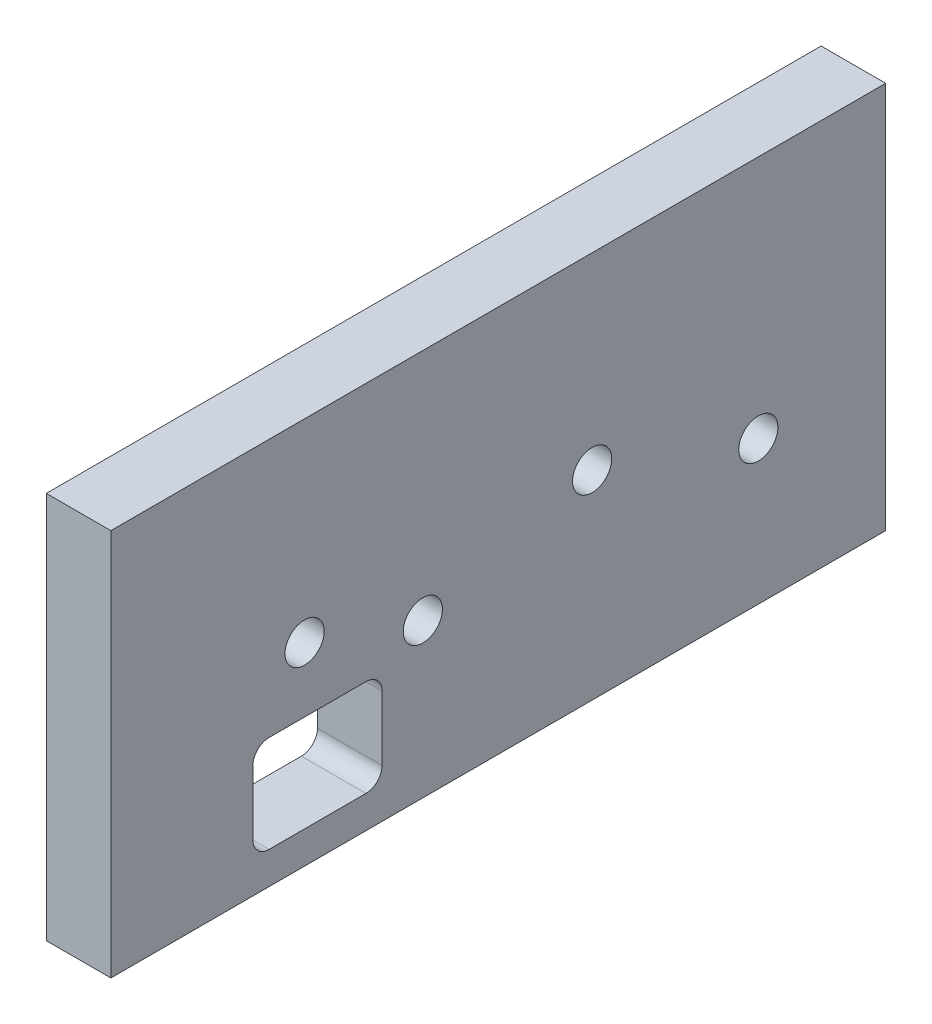
ISO-10303-21;
HEADER;
FILE_DESCRIPTION(('STEP AP214'),'2;1');
FILE_NAME('part.step','',(''),(''),'','','');
FILE_SCHEMA(('AUTOMOTIVE_DESIGN { 1 0 10303 214 1 1 1 1 }'));
ENDSEC;
DATA;
#1=APPLICATION_CONTEXT('core data for automotive mechanical design processes');
#2=APPLICATION_PROTOCOL_DEFINITION('international standard','automotive_design',2000,#1);
#3=PRODUCT_CONTEXT('',#1,'mechanical');
#4=PRODUCT('Part','Part','',(#3));
#5=PRODUCT_RELATED_PRODUCT_CATEGORY('part','',(#4));
#6=PRODUCT_DEFINITION_FORMATION('','',#4);
#7=PRODUCT_DEFINITION_CONTEXT('part definition',#1,'design');
#8=PRODUCT_DEFINITION('design','',#6,#7);
#9=PRODUCT_DEFINITION_SHAPE('','',#8);
#10=(LENGTH_UNIT() NAMED_UNIT(*) SI_UNIT(.MILLI.,.METRE.));
#11=(NAMED_UNIT(*) PLANE_ANGLE_UNIT() SI_UNIT($,.RADIAN.));
#12=(NAMED_UNIT(*) SI_UNIT($,.STERADIAN.) SOLID_ANGLE_UNIT());
#13=UNCERTAINTY_MEASURE_WITH_UNIT(LENGTH_MEASURE(1.E-05),#10,'distance_accuracy_value','');
#14=(GEOMETRIC_REPRESENTATION_CONTEXT(3) GLOBAL_UNCERTAINTY_ASSIGNED_CONTEXT((#13)) GLOBAL_UNIT_ASSIGNED_CONTEXT((#10,
#11,#12)) REPRESENTATION_CONTEXT('',''));
#15=CARTESIAN_POINT('',(0.,0.,0.));
#16=DIRECTION('',(0.,0.,1.));
#17=DIRECTION('',(1.,0.,0.));
#18=AXIS2_PLACEMENT_3D('',#15,#16,#17);
#19=CARTESIAN_POINT('',(12.7,-9.873506971,-51.1434579937716));
#20=DIRECTION('',(-1.,0.,0.));
#21=DIRECTION('',(0.,0.,1.));
#22=AXIS2_PLACEMENT_3D('',#19,#20,#21);
#23=CYLINDRICAL_SURFACE('',#22,3.85455777521835);
#24=CARTESIAN_POINT('',(12.7,-9.873506971,-51.1434579937716));
#25=DIRECTION('',(1.,0.,0.));
#26=DIRECTION('',(0.,0.,-1.));
#27=AXIS2_PLACEMENT_3D('',#24,#25,#26);
#28=CIRCLE('',#27,3.85455777521835);
#29=CARTESIAN_POINT('',(12.7,-9.873506971,-54.99801576899));
#30=VERTEX_POINT('',#29);
#31=EDGE_CURVE('E334',#30,#30,#28,.T.);
#32=ORIENTED_EDGE('',*,*,#31,.T.);
#33=EDGE_LOOP('',(#32));
#34=FACE_BOUND('',#33,.T.);
#35=CARTESIAN_POINT('',(5.08,-9.873506971,-51.1434579937716));
#36=DIRECTION('',(-1.,0.,0.));
#37=DIRECTION('',(0.,0.,1.));
#38=AXIS2_PLACEMENT_3D('',#35,#36,#37);
#39=CIRCLE('',#38,3.85455777521835);
#40=CARTESIAN_POINT('',(5.08,-9.873506971,-47.2889002185533));
#41=VERTEX_POINT('',#40);
#42=EDGE_CURVE('E54',#41,#41,#39,.T.);
#43=ORIENTED_EDGE('',*,*,#42,.T.);
#44=EDGE_LOOP('',(#43));
#45=FACE_BOUND('',#44,.T.);
#46=ADVANCED_FACE('F50',(#34,#45),#23,.F.);
#47=CARTESIAN_POINT('',(12.7,1.096077429,-18.4577335821185));
#48=DIRECTION('',(-1.,0.,0.));
#49=DIRECTION('',(0.,0.,1.));
#50=AXIS2_PLACEMENT_3D('',#47,#48,#49);
#51=CYLINDRICAL_SURFACE('',#50,3.85455777521835);
#52=CARTESIAN_POINT('',(12.7,1.096077429,-18.4577335821185));
#53=DIRECTION('',(1.,0.,0.));
#54=DIRECTION('',(0.,0.,-1.));
#55=AXIS2_PLACEMENT_3D('',#52,#53,#54);
#56=CIRCLE('',#55,3.85455777521835);
#57=CARTESIAN_POINT('',(12.7,1.096077429,-22.3122913573368));
#58=VERTEX_POINT('',#57);
#59=EDGE_CURVE('E330',#58,#58,#56,.T.);
#60=ORIENTED_EDGE('',*,*,#59,.T.);
#61=EDGE_LOOP('',(#60));
#62=FACE_BOUND('',#61,.T.);
#63=CARTESIAN_POINT('',(5.08,1.096077429,-18.4577335821185));
#64=DIRECTION('',(-1.,0.,0.));
#65=DIRECTION('',(0.,0.,1.));
#66=AXIS2_PLACEMENT_3D('',#63,#64,#65);
#67=CIRCLE('',#66,3.85455777521835);
#68=CARTESIAN_POINT('',(5.08,1.096077429,-14.6031758069001));
#69=VERTEX_POINT('',#68);
#70=EDGE_CURVE('E370',#69,#69,#67,.T.);
#71=ORIENTED_EDGE('',*,*,#70,.T.);
#72=EDGE_LOOP('',(#71));
#73=FACE_BOUND('',#72,.T.);
#74=ADVANCED_FACE('F460',(#62,#73),#51,.F.);
#75=CARTESIAN_POINT('',(12.7,0.,38.1));
#76=DIRECTION('',(-1.,0.,0.));
#77=DIRECTION('',(0.,0.,1.));
#78=AXIS2_PLACEMENT_3D('',#75,#76,#77);
#79=CYLINDRICAL_SURFACE('',#78,3.85455777521835);
#80=CARTESIAN_POINT('',(12.7,0.,38.1));
#81=DIRECTION('',(1.,0.,0.));
#82=DIRECTION('',(0.,0.,-1.));
#83=AXIS2_PLACEMENT_3D('',#80,#81,#82);
#84=CIRCLE('',#83,3.85455777521835);
#85=CARTESIAN_POINT('',(12.7,0.,34.2454422247817));
#86=VERTEX_POINT('',#85);
#87=EDGE_CURVE('E326',#86,#86,#84,.T.);
#88=ORIENTED_EDGE('',*,*,#87,.T.);
#89=EDGE_LOOP('',(#88));
#90=FACE_BOUND('',#89,.T.);
#91=CARTESIAN_POINT('',(5.08,0.,38.1));
#92=DIRECTION('',(-1.,0.,0.));
#93=DIRECTION('',(0.,0.,1.));
#94=AXIS2_PLACEMENT_3D('',#91,#92,#93);
#95=CIRCLE('',#94,3.85455777521835);
#96=CARTESIAN_POINT('',(5.08,0.,41.9545577752184));
#97=VERTEX_POINT('',#96);
#98=EDGE_CURVE('E367',#97,#97,#95,.T.);
#99=ORIENTED_EDGE('',*,*,#98,.T.);
#100=EDGE_LOOP('',(#99));
#101=FACE_BOUND('',#100,.T.);
#102=ADVANCED_FACE('F429',(#90,#101),#79,.F.);
#103=CARTESIAN_POINT('',(12.7,-7.860160654,14.8360220129459));
#104=DIRECTION('',(-1.,0.,0.));
#105=DIRECTION('',(0.,0.,1.));
#106=AXIS2_PLACEMENT_3D('',#103,#104,#105);
#107=CYLINDRICAL_SURFACE('',#106,3.85455777521835);
#108=CARTESIAN_POINT('',(12.7,-7.860160654,14.8360220129459));
#109=DIRECTION('',(1.,0.,0.));
#110=DIRECTION('',(0.,0.,-1.));
#111=AXIS2_PLACEMENT_3D('',#108,#109,#110);
#112=CIRCLE('',#111,3.85455777521835);
#113=CARTESIAN_POINT('',(12.7,-7.860160654,10.9814642377276));
#114=VERTEX_POINT('',#113);
#115=EDGE_CURVE('E338',#114,#114,#112,.T.);
#116=ORIENTED_EDGE('',*,*,#115,.T.);
#117=EDGE_LOOP('',(#116));
#118=FACE_BOUND('',#117,.T.);
#119=CARTESIAN_POINT('',(5.08,-7.860160654,14.8360220129459));
#120=DIRECTION('',(-1.,0.,0.));
#121=DIRECTION('',(0.,0.,1.));
#122=AXIS2_PLACEMENT_3D('',#119,#120,#121);
#123=CIRCLE('',#122,3.85455777521835);
#124=CARTESIAN_POINT('',(5.08,-7.860160654,18.6905797881643));
#125=VERTEX_POINT('',#124);
#126=EDGE_CURVE('E257',#125,#125,#123,.T.);
#127=ORIENTED_EDGE('',*,*,#126,.T.);
#128=EDGE_LOOP('',(#127));
#129=FACE_BOUND('',#128,.T.);
#130=ADVANCED_FACE('F426',(#118,#129),#107,.F.);
#131=CARTESIAN_POINT('',(12.7,-38.1,0.));
#132=DIRECTION('',(0.,1.,0.));
#133=DIRECTION('',(0.,0.,1.));
#134=AXIS2_PLACEMENT_3D('',#131,#132,#133);
#135=PLANE('',#134);
#136=CARTESIAN_POINT('',(6.35000000000002,-38.1,-63.5));
#137=DIRECTION('',(0.,-1.,0.));
#138=DIRECTION('',(0.,0.,-1.));
#139=AXIS2_PLACEMENT_3D('',#136,#137,#138);
#140=CIRCLE('',#139,3.17499999999999);
#141=CARTESIAN_POINT('',(6.35000000000002,-38.1,-66.675));
#142=VERTEX_POINT('',#141);
#143=EDGE_CURVE('E285',#142,#142,#140,.T.);
#144=ORIENTED_EDGE('',*,*,#143,.F.);
#145=EDGE_LOOP('',(#144));
#146=FACE_BOUND('',#145,.T.);
#147=CARTESIAN_POINT('',(6.35000000000001,-38.1,0.));
#148=DIRECTION('',(0.,-1.,0.));
#149=DIRECTION('',(0.,0.,-1.));
#150=AXIS2_PLACEMENT_3D('',#147,#148,#149);
#151=CIRCLE('',#150,3.17499999999999);
#152=CARTESIAN_POINT('',(6.35000000000001,-38.1,-3.17499999999997));
#153=VERTEX_POINT('',#152);
#154=EDGE_CURVE('E293',#153,#153,#151,.T.);
#155=ORIENTED_EDGE('',*,*,#154,.F.);
#156=EDGE_LOOP('',(#155));
#157=FACE_BOUND('',#156,.T.);
#158=CARTESIAN_POINT('',(6.35,-38.1,57.15));
#159=DIRECTION('',(0.,-1.,0.));
#160=DIRECTION('',(0.,0.,-1.));
#161=AXIS2_PLACEMENT_3D('',#158,#159,#160);
#162=CIRCLE('',#161,3.17499999999999);
#163=CARTESIAN_POINT('',(6.35,-38.1,53.975));
#164=VERTEX_POINT('',#163);
#165=EDGE_CURVE('E301',#164,#164,#162,.T.);
#166=ORIENTED_EDGE('',*,*,#165,.F.);
#167=EDGE_LOOP('',(#166));
#168=FACE_BOUND('',#167,.T.);
#169=DIRECTION('',(0.,0.,-1.));
#170=VECTOR('',#169,1.);
#171=CARTESIAN_POINT('',(0.,-38.1,0.));
#172=LINE('',#171,#170);
#173=CARTESIAN_POINT('',(0.,-38.1,76.2));
#174=VERTEX_POINT('',#173);
#175=CARTESIAN_POINT('',(0.,-38.1,-76.2));
#176=VERTEX_POINT('',#175);
#177=EDGE_CURVE('E309',#174,#176,#172,.T.);
#178=ORIENTED_EDGE('',*,*,#177,.T.);
#179=DIRECTION('',(-1.,0.,0.));
#180=VECTOR('',#179,1.);
#181=CARTESIAN_POINT('',(12.7,-38.1,-76.2));
#182=LINE('',#181,#180);
#183=CARTESIAN_POINT('',(12.7,-38.1,-76.2));
#184=VERTEX_POINT('',#183);
#185=EDGE_CURVE('E11',#184,#176,#182,.T.);
#186=ORIENTED_EDGE('',*,*,#185,.F.);
#187=DIRECTION('',(0.,0.,-1.));
#188=VECTOR('',#187,1.);
#189=CARTESIAN_POINT('',(12.7,-38.1,0.));
#190=LINE('',#189,#188);
#191=CARTESIAN_POINT('',(12.7,-38.1,76.2));
#192=VERTEX_POINT('',#191);
#193=EDGE_CURVE('E310',#192,#184,#190,.T.);
#194=ORIENTED_EDGE('',*,*,#193,.F.);
#195=DIRECTION('',(-1.,0.,0.));
#196=VECTOR('',#195,1.);
#197=CARTESIAN_POINT('',(12.7,-38.1,76.2));
#198=LINE('',#197,#196);
#199=EDGE_CURVE('E342',#192,#174,#198,.T.);
#200=ORIENTED_EDGE('',*,*,#199,.T.);
#201=EDGE_LOOP('',(#178,#186,#194,#200));
#202=FACE_BOUND('',#201,.T.);
#203=ADVANCED_FACE('F52',(#146,#157,#168,#202),#135,.F.);
#204=CARTESIAN_POINT('',(12.7,0.,-76.2));
#205=DIRECTION('',(0.,0.,1.));
#206=DIRECTION('',(1.,0.,0.));
#207=AXIS2_PLACEMENT_3D('',#204,#205,#206);
#208=PLANE('',#207);
#209=DIRECTION('',(0.,1.,0.));
#210=VECTOR('',#209,1.);
#211=CARTESIAN_POINT('',(0.,0.,-76.2));
#212=LINE('',#211,#210);
#213=CARTESIAN_POINT('',(0.,38.1,-76.2));
#214=VERTEX_POINT('',#213);
#215=EDGE_CURVE('E346',#176,#214,#212,.T.);
#216=ORIENTED_EDGE('',*,*,#215,.T.);
#217=DIRECTION('',(-1.,0.,0.));
#218=VECTOR('',#217,1.);
#219=CARTESIAN_POINT('',(12.7,38.1,-76.2));
#220=LINE('',#219,#218);
#221=CARTESIAN_POINT('',(12.7,38.1,-76.2));
#222=VERTEX_POINT('',#221);
#223=EDGE_CURVE('E60',#222,#214,#220,.T.);
#224=ORIENTED_EDGE('',*,*,#223,.F.);
#225=DIRECTION('',(0.,1.,0.));
#226=VECTOR('',#225,1.);
#227=CARTESIAN_POINT('',(12.7,0.,-76.2));
#228=LINE('',#227,#226);
#229=EDGE_CURVE('E314',#184,#222,#228,.T.);
#230=ORIENTED_EDGE('',*,*,#229,.F.);
#231=ORIENTED_EDGE('',*,*,#185,.T.);
#232=EDGE_LOOP('',(#216,#224,#230,#231));
#233=FACE_BOUND('',#232,.T.);
#234=ADVANCED_FACE('F414',(#233),#208,.F.);
#235=CARTESIAN_POINT('',(12.7,38.1,0.));
#236=DIRECTION('',(0.,1.,0.));
#237=DIRECTION('',(0.,0.,1.));
#238=AXIS2_PLACEMENT_3D('',#235,#236,#237);
#239=PLANE('',#238);
#240=DIRECTION('',(0.,0.,-1.));
#241=VECTOR('',#240,1.);
#242=CARTESIAN_POINT('',(0.,38.1,0.));
#243=LINE('',#242,#241);
#244=CARTESIAN_POINT('',(0.,38.1,76.2));
#245=VERTEX_POINT('',#244);
#246=EDGE_CURVE('E350',#245,#214,#243,.T.);
#247=ORIENTED_EDGE('',*,*,#246,.F.);
#248=DIRECTION('',(-1.,0.,0.));
#249=VECTOR('',#248,1.);
#250=CARTESIAN_POINT('',(12.7,38.1,76.2));
#251=LINE('',#250,#249);
#252=CARTESIAN_POINT('',(12.7,38.1,76.2));
#253=VERTEX_POINT('',#252);
#254=EDGE_CURVE('E359',#253,#245,#251,.T.);
#255=ORIENTED_EDGE('',*,*,#254,.F.);
#256=DIRECTION('',(0.,0.,-1.));
#257=VECTOR('',#256,1.);
#258=CARTESIAN_POINT('',(12.7,38.1,0.));
#259=LINE('',#258,#257);
#260=EDGE_CURVE('E318',#253,#222,#259,.T.);
#261=ORIENTED_EDGE('',*,*,#260,.T.);
#262=ORIENTED_EDGE('',*,*,#223,.T.);
#263=EDGE_LOOP('',(#247,#255,#261,#262));
#264=FACE_BOUND('',#263,.T.);
#265=ADVANCED_FACE('F411',(#264),#239,.T.);
#266=CARTESIAN_POINT('',(12.7,0.,76.2));
#267=DIRECTION('',(0.,0.,1.));
#268=DIRECTION('',(1.,0.,0.));
#269=AXIS2_PLACEMENT_3D('',#266,#267,#268);
#270=PLANE('',#269);
#271=DIRECTION('',(0.,1.,0.));
#272=VECTOR('',#271,1.);
#273=CARTESIAN_POINT('',(0.,0.,76.2));
#274=LINE('',#273,#272);
#275=EDGE_CURVE('E315',#174,#245,#274,.T.);
#276=ORIENTED_EDGE('',*,*,#275,.F.);
#277=ORIENTED_EDGE('',*,*,#199,.F.);
#278=DIRECTION('',(0.,1.,0.));
#279=VECTOR('',#278,1.);
#280=CARTESIAN_POINT('',(12.7,0.,76.2));
#281=LINE('',#280,#279);
#282=EDGE_CURVE('E322',#192,#253,#281,.T.);
#283=ORIENTED_EDGE('',*,*,#282,.T.);
#284=ORIENTED_EDGE('',*,*,#254,.T.);
#285=EDGE_LOOP('',(#276,#277,#283,#284));
#286=FACE_BOUND('',#285,.T.);
#287=ADVANCED_FACE('F405',(#286),#270,.T.);
#288=CARTESIAN_POINT('',(12.7,0.,0.));
#289=DIRECTION('',(1.,0.,0.));
#290=DIRECTION('',(0.,0.,-1.));
#291=AXIS2_PLACEMENT_3D('',#288,#289,#290);
#292=PLANE('',#291);
#293=CARTESIAN_POINT('',(12.7,-15.875,45.085));
#294=DIRECTION('',(-1.,0.,0.));
#295=DIRECTION('',(0.,0.,-1.));
#296=AXIS2_PLACEMENT_3D('',#293,#294,#295);
#297=CIRCLE('',#296,3.175);
#298=CARTESIAN_POINT('',(12.7,-15.875,48.26));
#299=VERTEX_POINT('',#298);
#300=CARTESIAN_POINT('',(12.7,-12.7,45.085));
#301=VERTEX_POINT('',#300);
#302=EDGE_CURVE('E162',#299,#301,#297,.T.);
#303=ORIENTED_EDGE('',*,*,#302,.T.);
#304=DIRECTION('',(0.,0.,-1.));
#305=VECTOR('',#304,1.);
#306=CARTESIAN_POINT('',(12.7,-12.7,26.035));
#307=LINE('',#306,#305);
#308=CARTESIAN_POINT('',(12.7,-12.7,26.035));
#309=VERTEX_POINT('',#308);
#310=EDGE_CURVE('E172',#301,#309,#307,.T.);
#311=ORIENTED_EDGE('',*,*,#310,.T.);
#312=CARTESIAN_POINT('',(12.7,-15.875,26.035));
#313=DIRECTION('',(-1.,0.,0.));
#314=DIRECTION('',(0.,0.,1.));
#315=AXIS2_PLACEMENT_3D('',#312,#313,#314);
#316=CIRCLE('',#315,3.175);
#317=CARTESIAN_POINT('',(12.7,-15.875,22.86));
#318=VERTEX_POINT('',#317);
#319=EDGE_CURVE('E71',#309,#318,#316,.T.);
#320=ORIENTED_EDGE('',*,*,#319,.T.);
#321=DIRECTION('',(0.,-1.,0.));
#322=VECTOR('',#321,1.);
#323=CARTESIAN_POINT('',(12.7,-15.875,22.86));
#324=LINE('',#323,#322);
#325=CARTESIAN_POINT('',(12.7,-28.575,22.86));
#326=VERTEX_POINT('',#325);
#327=EDGE_CURVE('E191',#318,#326,#324,.T.);
#328=ORIENTED_EDGE('',*,*,#327,.T.);
#329=CARTESIAN_POINT('',(12.7,-28.575,26.035));
#330=DIRECTION('',(-1.,0.,0.));
#331=DIRECTION('',(0.,0.,1.));
#332=AXIS2_PLACEMENT_3D('',#329,#330,#331);
#333=CIRCLE('',#332,3.175);
#334=CARTESIAN_POINT('',(12.7,-31.75,26.035));
#335=VERTEX_POINT('',#334);
#336=EDGE_CURVE('E195',#326,#335,#333,.T.);
#337=ORIENTED_EDGE('',*,*,#336,.T.);
#338=DIRECTION('',(0.,0.,1.));
#339=VECTOR('',#338,1.);
#340=CARTESIAN_POINT('',(12.7,-31.75,26.035));
#341=LINE('',#340,#339);
#342=CARTESIAN_POINT('',(12.7,-31.75,45.085));
#343=VERTEX_POINT('',#342);
#344=EDGE_CURVE('E199',#335,#343,#341,.T.);
#345=ORIENTED_EDGE('',*,*,#344,.T.);
#346=CARTESIAN_POINT('',(12.7,-28.575,45.085));
#347=DIRECTION('',(-1.,0.,0.));
#348=DIRECTION('',(0.,0.,1.));
#349=AXIS2_PLACEMENT_3D('',#346,#347,#348);
#350=CIRCLE('',#349,3.175);
#351=CARTESIAN_POINT('',(12.7,-28.575,48.26));
#352=VERTEX_POINT('',#351);
#353=EDGE_CURVE('E203',#343,#352,#350,.T.);
#354=ORIENTED_EDGE('',*,*,#353,.T.);
#355=DIRECTION('',(0.,1.,0.));
#356=VECTOR('',#355,1.);
#357=CARTESIAN_POINT('',(12.7,-15.875,48.26));
#358=LINE('',#357,#356);
#359=EDGE_CURVE('E169',#352,#299,#358,.T.);
#360=ORIENTED_EDGE('',*,*,#359,.T.);
#361=EDGE_LOOP('',(#303,#311,#320,#328,#337,#345,#354,#360));
#362=FACE_BOUND('',#361,.T.);
#363=ORIENTED_EDGE('',*,*,#193,.T.);
#364=ORIENTED_EDGE('',*,*,#229,.T.);
#365=ORIENTED_EDGE('',*,*,#260,.F.);
#366=ORIENTED_EDGE('',*,*,#282,.F.);
#367=EDGE_LOOP('',(#363,#364,#365,#366));
#368=FACE_BOUND('',#367,.T.);
#369=ORIENTED_EDGE('',*,*,#87,.F.);
#370=EDGE_LOOP('',(#369));
#371=FACE_BOUND('',#370,.T.);
#372=ORIENTED_EDGE('',*,*,#59,.F.);
#373=EDGE_LOOP('',(#372));
#374=FACE_BOUND('',#373,.T.);
#375=ORIENTED_EDGE('',*,*,#31,.F.);
#376=EDGE_LOOP('',(#375));
#377=FACE_BOUND('',#376,.T.);
#378=ORIENTED_EDGE('',*,*,#115,.F.);
#379=EDGE_LOOP('',(#378));
#380=FACE_BOUND('',#379,.T.);
#381=ADVANCED_FACE('F177',(#362,#368,#371,#374,#377,#380),#292,.T.);
#382=CARTESIAN_POINT('',(0.,0.,0.));
#383=DIRECTION('',(1.,0.,0.));
#384=DIRECTION('',(0.,0.,-1.));
#385=AXIS2_PLACEMENT_3D('',#382,#383,#384);
#386=PLANE('',#385);
#387=DIRECTION('',(0.,0.,-1.));
#388=VECTOR('',#387,1.);
#389=CARTESIAN_POINT('',(0.,-12.7,26.035));
#390=LINE('',#389,#388);
#391=CARTESIAN_POINT('',(0.,-12.7,45.085));
#392=VERTEX_POINT('',#391);
#393=CARTESIAN_POINT('',(0.,-12.7,26.035));
#394=VERTEX_POINT('',#393);
#395=EDGE_CURVE('E210',#392,#394,#390,.T.);
#396=ORIENTED_EDGE('',*,*,#395,.F.);
#397=CARTESIAN_POINT('',(0.,-15.875,45.085));
#398=DIRECTION('',(-1.,0.,0.));
#399=DIRECTION('',(0.,0.,-1.));
#400=AXIS2_PLACEMENT_3D('',#397,#398,#399);
#401=CIRCLE('',#400,3.175);
#402=CARTESIAN_POINT('',(0.,-15.875,48.26));
#403=VERTEX_POINT('',#402);
#404=EDGE_CURVE('E82',#403,#392,#401,.T.);
#405=ORIENTED_EDGE('',*,*,#404,.F.);
#406=DIRECTION('',(0.,1.,0.));
#407=VECTOR('',#406,1.);
#408=CARTESIAN_POINT('',(0.,-15.875,48.26));
#409=LINE('',#408,#407);
#410=CARTESIAN_POINT('',(0.,-28.575,48.26));
#411=VERTEX_POINT('',#410);
#412=EDGE_CURVE('E182',#411,#403,#409,.T.);
#413=ORIENTED_EDGE('',*,*,#412,.F.);
#414=CARTESIAN_POINT('',(0.,-28.575,45.085));
#415=DIRECTION('',(-1.,0.,0.));
#416=DIRECTION('',(0.,0.,1.));
#417=AXIS2_PLACEMENT_3D('',#414,#415,#416);
#418=CIRCLE('',#417,3.175);
#419=CARTESIAN_POINT('',(0.,-31.75,45.085));
#420=VERTEX_POINT('',#419);
#421=EDGE_CURVE('E186',#420,#411,#418,.T.);
#422=ORIENTED_EDGE('',*,*,#421,.F.);
#423=DIRECTION('',(0.,0.,1.));
#424=VECTOR('',#423,1.);
#425=CARTESIAN_POINT('',(0.,-31.75,26.035));
#426=LINE('',#425,#424);
#427=CARTESIAN_POINT('',(0.,-31.75,26.035));
#428=VERTEX_POINT('',#427);
#429=EDGE_CURVE('E225',#428,#420,#426,.T.);
#430=ORIENTED_EDGE('',*,*,#429,.F.);
#431=CARTESIAN_POINT('',(0.,-28.575,26.035));
#432=DIRECTION('',(-1.,0.,0.));
#433=DIRECTION('',(0.,0.,1.));
#434=AXIS2_PLACEMENT_3D('',#431,#432,#433);
#435=CIRCLE('',#434,3.175);
#436=CARTESIAN_POINT('',(0.,-28.575,22.86));
#437=VERTEX_POINT('',#436);
#438=EDGE_CURVE('E221',#437,#428,#435,.T.);
#439=ORIENTED_EDGE('',*,*,#438,.F.);
#440=DIRECTION('',(0.,-1.,0.));
#441=VECTOR('',#440,1.);
#442=CARTESIAN_POINT('',(0.,-15.875,22.86));
#443=LINE('',#442,#441);
#444=CARTESIAN_POINT('',(0.,-15.875,22.86));
#445=VERTEX_POINT('',#444);
#446=EDGE_CURVE('E217',#445,#437,#443,.T.);
#447=ORIENTED_EDGE('',*,*,#446,.F.);
#448=CARTESIAN_POINT('',(0.,-15.875,26.035));
#449=DIRECTION('',(-1.,0.,0.));
#450=DIRECTION('',(0.,0.,1.));
#451=AXIS2_PLACEMENT_3D('',#448,#449,#450);
#452=CIRCLE('',#451,3.175);
#453=EDGE_CURVE('E213',#394,#445,#452,.T.);
#454=ORIENTED_EDGE('',*,*,#453,.F.);
#455=EDGE_LOOP('',(#396,#405,#413,#422,#430,#439,#447,#454));
#456=FACE_BOUND('',#455,.T.);
#457=CARTESIAN_POINT('',(0.,0.,38.1));
#458=DIRECTION('',(-1.,0.,0.));
#459=DIRECTION('',(0.,0.,1.));
#460=AXIS2_PLACEMENT_3D('',#457,#458,#459);
#461=CIRCLE('',#460,7.9375);
#462=CARTESIAN_POINT('',(0.,0.,46.0375));
#463=VERTEX_POINT('',#462);
#464=EDGE_CURVE('E258',#463,#463,#461,.T.);
#465=ORIENTED_EDGE('',*,*,#464,.F.);
#466=EDGE_LOOP('',(#465));
#467=FACE_BOUND('',#466,.T.);
#468=CARTESIAN_POINT('',(0.,-7.860160654,14.8360220129459));
#469=DIRECTION('',(-1.,0.,0.));
#470=DIRECTION('',(0.,0.,1.));
#471=AXIS2_PLACEMENT_3D('',#468,#469,#470);
#472=CIRCLE('',#471,7.9375);
#473=CARTESIAN_POINT('',(0.,-7.860160654,22.7735220129459));
#474=VERTEX_POINT('',#473);
#475=EDGE_CURVE('E262',#474,#474,#472,.T.);
#476=ORIENTED_EDGE('',*,*,#475,.F.);
#477=EDGE_LOOP('',(#476));
#478=FACE_BOUND('',#477,.T.);
#479=CARTESIAN_POINT('',(0.,1.096077429,-18.4577335821185));
#480=DIRECTION('',(-1.,0.,0.));
#481=DIRECTION('',(0.,0.,1.));
#482=AXIS2_PLACEMENT_3D('',#479,#480,#481);
#483=CIRCLE('',#482,7.9375);
#484=CARTESIAN_POINT('',(0.,1.096077429,-10.5202335821185));
#485=VERTEX_POINT('',#484);
#486=EDGE_CURVE('E270',#485,#485,#483,.T.);
#487=ORIENTED_EDGE('',*,*,#486,.F.);
#488=EDGE_LOOP('',(#487));
#489=FACE_BOUND('',#488,.T.);
#490=CARTESIAN_POINT('',(0.,-9.873506971,-51.1434579937716));
#491=DIRECTION('',(-1.,0.,0.));
#492=DIRECTION('',(0.,0.,1.));
#493=AXIS2_PLACEMENT_3D('',#490,#491,#492);
#494=CIRCLE('',#493,7.9375);
#495=CARTESIAN_POINT('',(0.,-9.873506971,-43.2059579937716));
#496=VERTEX_POINT('',#495);
#497=EDGE_CURVE('E278',#496,#496,#494,.T.);
#498=ORIENTED_EDGE('',*,*,#497,.F.);
#499=EDGE_LOOP('',(#498));
#500=FACE_BOUND('',#499,.T.);
#501=ORIENTED_EDGE('',*,*,#177,.F.);
#502=ORIENTED_EDGE('',*,*,#275,.T.);
#503=ORIENTED_EDGE('',*,*,#246,.T.);
#504=ORIENTED_EDGE('',*,*,#215,.F.);
#505=EDGE_LOOP('',(#501,#502,#503,#504));
#506=FACE_BOUND('',#505,.T.);
#507=ADVANCED_FACE('F394',(#456,#467,#478,#489,#500,#506),#386,.F.);
#508=CARTESIAN_POINT('',(6.35,0.,57.15));
#509=DIRECTION('',(0.,-1.,0.));
#510=DIRECTION('',(0.,0.,-1.));
#511=AXIS2_PLACEMENT_3D('',#508,#509,#510);
#512=CONICAL_SURFACE('',#511,3.17499999999999,1.02974425867665);
#513=CARTESIAN_POINT('',(6.34999999999999,1.9077324654125,57.15));
#514=VERTEX_POINT('',#513);
#515=VERTEX_LOOP('',#514);
#516=FACE_BOUND('',#515,.T.);
#517=CARTESIAN_POINT('',(6.35,0.,57.15));
#518=DIRECTION('',(0.,-1.,0.));
#519=DIRECTION('',(0.,0.,-1.));
#520=AXIS2_PLACEMENT_3D('',#517,#518,#519);
#521=CIRCLE('',#520,3.17499999999999);
#522=CARTESIAN_POINT('',(6.35,0.,53.975));
#523=VERTEX_POINT('',#522);
#524=EDGE_CURVE('E305',#523,#523,#521,.T.);
#525=ORIENTED_EDGE('',*,*,#524,.T.);
#526=EDGE_LOOP('',(#525));
#527=FACE_BOUND('',#526,.T.);
#528=ADVANCED_FACE('F397',(#516,#527),#512,.F.);
#529=CARTESIAN_POINT('',(6.35,-38.1,57.15));
#530=DIRECTION('',(0.,-1.,0.));
#531=DIRECTION('',(0.,0.,-1.));
#532=AXIS2_PLACEMENT_3D('',#529,#530,#531);
#533=CYLINDRICAL_SURFACE('',#532,3.17499999999999);
#534=ORIENTED_EDGE('',*,*,#524,.F.);
#535=EDGE_LOOP('',(#534));
#536=FACE_BOUND('',#535,.T.);
#537=ORIENTED_EDGE('',*,*,#165,.T.);
#538=EDGE_LOOP('',(#537));
#539=FACE_BOUND('',#538,.T.);
#540=ADVANCED_FACE('F489',(#536,#539),#533,.F.);
#541=CARTESIAN_POINT('',(6.35000000000001,0.,0.));
#542=DIRECTION('',(0.,-1.,0.));
#543=DIRECTION('',(0.,0.,-1.));
#544=AXIS2_PLACEMENT_3D('',#541,#542,#543);
#545=CONICAL_SURFACE('',#544,3.17499999999999,1.02974425867665);
#546=CARTESIAN_POINT('',(6.35,1.9077324654125,0.));
#547=VERTEX_POINT('',#546);
#548=VERTEX_LOOP('',#547);
#549=FACE_BOUND('',#548,.T.);
#550=CARTESIAN_POINT('',(6.35000000000001,0.,0.));
#551=DIRECTION('',(0.,-1.,0.));
#552=DIRECTION('',(0.,0.,-1.));
#553=AXIS2_PLACEMENT_3D('',#550,#551,#552);
#554=CIRCLE('',#553,3.17499999999999);
#555=CARTESIAN_POINT('',(6.35000000000001,0.,-3.17499999999998));
#556=VERTEX_POINT('',#555);
#557=EDGE_CURVE('E297',#556,#556,#554,.T.);
#558=ORIENTED_EDGE('',*,*,#557,.T.);
#559=EDGE_LOOP('',(#558));
#560=FACE_BOUND('',#559,.T.);
#561=ADVANCED_FACE('F491',(#549,#560),#545,.F.);
#562=CARTESIAN_POINT('',(6.35000000000001,-38.1,0.));
#563=DIRECTION('',(0.,-1.,0.));
#564=DIRECTION('',(0.,0.,-1.));
#565=AXIS2_PLACEMENT_3D('',#562,#563,#564);
#566=CYLINDRICAL_SURFACE('',#565,3.17499999999999);
#567=ORIENTED_EDGE('',*,*,#557,.F.);
#568=EDGE_LOOP('',(#567));
#569=FACE_BOUND('',#568,.T.);
#570=ORIENTED_EDGE('',*,*,#154,.T.);
#571=EDGE_LOOP('',(#570));
#572=FACE_BOUND('',#571,.T.);
#573=ADVANCED_FACE('F496',(#569,#572),#566,.F.);
#574=CARTESIAN_POINT('',(6.35000000000002,0.,-63.5));
#575=DIRECTION('',(0.,-1.,0.));
#576=DIRECTION('',(0.,0.,-1.));
#577=AXIS2_PLACEMENT_3D('',#574,#575,#576);
#578=CONICAL_SURFACE('',#577,3.17499999999999,1.02974425867665);
#579=CARTESIAN_POINT('',(6.35000000000001,1.9077324654125,-63.5));
#580=VERTEX_POINT('',#579);
#581=VERTEX_LOOP('',#580);
#582=FACE_BOUND('',#581,.T.);
#583=CARTESIAN_POINT('',(6.35000000000002,0.,-63.5));
#584=DIRECTION('',(0.,-1.,0.));
#585=DIRECTION('',(0.,0.,-1.));
#586=AXIS2_PLACEMENT_3D('',#583,#584,#585);
#587=CIRCLE('',#586,3.17499999999999);
#588=CARTESIAN_POINT('',(6.35000000000002,0.,-66.675));
#589=VERTEX_POINT('',#588);
#590=EDGE_CURVE('E289',#589,#589,#587,.T.);
#591=ORIENTED_EDGE('',*,*,#590,.T.);
#592=EDGE_LOOP('',(#591));
#593=FACE_BOUND('',#592,.T.);
#594=ADVANCED_FACE('F506',(#582,#593),#578,.F.);
#595=CARTESIAN_POINT('',(6.35000000000002,-38.1,-63.5));
#596=DIRECTION('',(0.,-1.,0.));
#597=DIRECTION('',(0.,0.,-1.));
#598=AXIS2_PLACEMENT_3D('',#595,#596,#597);
#599=CYLINDRICAL_SURFACE('',#598,3.17499999999999);
#600=ORIENTED_EDGE('',*,*,#590,.F.);
#601=EDGE_LOOP('',(#600));
#602=FACE_BOUND('',#601,.T.);
#603=ORIENTED_EDGE('',*,*,#143,.T.);
#604=EDGE_LOOP('',(#603));
#605=FACE_BOUND('',#604,.T.);
#606=ADVANCED_FACE('F390',(#602,#605),#599,.F.);
#607=CARTESIAN_POINT('',(5.08,-9.873506971,-51.1434579937716));
#608=DIRECTION('',(-1.,0.,0.));
#609=DIRECTION('',(0.,0.,1.));
#610=AXIS2_PLACEMENT_3D('',#607,#608,#609);
#611=CYLINDRICAL_SURFACE('',#610,7.9375);
#612=CARTESIAN_POINT('',(5.08,-9.873506971,-51.1434579937716));
#613=DIRECTION('',(-1.,0.,0.));
#614=DIRECTION('',(0.,0.,1.));
#615=AXIS2_PLACEMENT_3D('',#612,#613,#614);
#616=CIRCLE('',#615,7.9375);
#617=CARTESIAN_POINT('',(5.08,-9.873506971,-43.2059579937716));
#618=VERTEX_POINT('',#617);
#619=EDGE_CURVE('E235',#618,#618,#616,.T.);
#620=ORIENTED_EDGE('',*,*,#619,.F.);
#621=EDGE_LOOP('',(#620));
#622=FACE_BOUND('',#621,.T.);
#623=ORIENTED_EDGE('',*,*,#497,.T.);
#624=EDGE_LOOP('',(#623));
#625=FACE_BOUND('',#624,.T.);
#626=ADVANCED_FACE('F384',(#622,#625),#611,.F.);
#627=CARTESIAN_POINT('',(5.08,-9.873506971,-51.1434579937716));
#628=DIRECTION('',(-1.,0.,0.));
#629=DIRECTION('',(0.,0.,1.));
#630=AXIS2_PLACEMENT_3D('',#627,#628,#629);
#631=PLANE('',#630);
#632=ORIENTED_EDGE('',*,*,#42,.F.);
#633=EDGE_LOOP('',(#632));
#634=FACE_BOUND('',#633,.T.);
#635=ORIENTED_EDGE('',*,*,#619,.T.);
#636=EDGE_LOOP('',(#635));
#637=FACE_BOUND('',#636,.T.);
#638=ADVANCED_FACE('F380',(#634,#637),#631,.T.);
#639=CARTESIAN_POINT('',(5.08,1.096077429,-18.4577335821185));
#640=DIRECTION('',(-1.,0.,0.));
#641=DIRECTION('',(0.,0.,1.));
#642=AXIS2_PLACEMENT_3D('',#639,#640,#641);
#643=CYLINDRICAL_SURFACE('',#642,7.9375);
#644=CARTESIAN_POINT('',(5.08,1.096077429,-18.4577335821185));
#645=DIRECTION('',(-1.,0.,0.));
#646=DIRECTION('',(0.,0.,1.));
#647=AXIS2_PLACEMENT_3D('',#644,#645,#646);
#648=CIRCLE('',#647,7.9375);
#649=CARTESIAN_POINT('',(5.08,1.096077429,-10.5202335821185));
#650=VERTEX_POINT('',#649);
#651=EDGE_CURVE('E274',#650,#650,#648,.T.);
#652=ORIENTED_EDGE('',*,*,#651,.F.);
#653=EDGE_LOOP('',(#652));
#654=FACE_BOUND('',#653,.T.);
#655=ORIENTED_EDGE('',*,*,#486,.T.);
#656=EDGE_LOOP('',(#655));
#657=FACE_BOUND('',#656,.T.);
#658=ADVANCED_FACE('F383',(#654,#657),#643,.F.);
#659=CARTESIAN_POINT('',(5.08,1.096077429,-18.4577335821185));
#660=DIRECTION('',(-1.,0.,0.));
#661=DIRECTION('',(0.,0.,1.));
#662=AXIS2_PLACEMENT_3D('',#659,#660,#661);
#663=PLANE('',#662);
#664=ORIENTED_EDGE('',*,*,#70,.F.);
#665=EDGE_LOOP('',(#664));
#666=FACE_BOUND('',#665,.T.);
#667=ORIENTED_EDGE('',*,*,#651,.T.);
#668=EDGE_LOOP('',(#667));
#669=FACE_BOUND('',#668,.T.);
#670=ADVANCED_FACE('F443',(#666,#669),#663,.T.);
#671=CARTESIAN_POINT('',(5.08,-7.860160654,14.8360220129459));
#672=DIRECTION('',(-1.,0.,0.));
#673=DIRECTION('',(0.,0.,1.));
#674=AXIS2_PLACEMENT_3D('',#671,#672,#673);
#675=CYLINDRICAL_SURFACE('',#674,7.9375);
#676=CARTESIAN_POINT('',(5.08,-7.860160654,14.8360220129459));
#677=DIRECTION('',(-1.,0.,0.));
#678=DIRECTION('',(0.,0.,1.));
#679=AXIS2_PLACEMENT_3D('',#676,#677,#678);
#680=CIRCLE('',#679,7.9375);
#681=CARTESIAN_POINT('',(5.08,-7.860160654,22.7735220129459));
#682=VERTEX_POINT('',#681);
#683=EDGE_CURVE('E266',#682,#682,#680,.T.);
#684=ORIENTED_EDGE('',*,*,#683,.F.);
#685=EDGE_LOOP('',(#684));
#686=FACE_BOUND('',#685,.T.);
#687=ORIENTED_EDGE('',*,*,#475,.T.);
#688=EDGE_LOOP('',(#687));
#689=FACE_BOUND('',#688,.T.);
#690=ADVANCED_FACE('F437',(#686,#689),#675,.F.);
#691=CARTESIAN_POINT('',(5.08,-7.860160654,14.8360220129459));
#692=DIRECTION('',(-1.,0.,0.));
#693=DIRECTION('',(0.,0.,1.));
#694=AXIS2_PLACEMENT_3D('',#691,#692,#693);
#695=PLANE('',#694);
#696=ORIENTED_EDGE('',*,*,#126,.F.);
#697=EDGE_LOOP('',(#696));
#698=FACE_BOUND('',#697,.T.);
#699=ORIENTED_EDGE('',*,*,#683,.T.);
#700=EDGE_LOOP('',(#699));
#701=FACE_BOUND('',#700,.T.);
#702=ADVANCED_FACE('F433',(#698,#701),#695,.T.);
#703=CARTESIAN_POINT('',(5.08,0.,38.1));
#704=DIRECTION('',(-1.,0.,0.));
#705=DIRECTION('',(0.,0.,1.));
#706=AXIS2_PLACEMENT_3D('',#703,#704,#705);
#707=CYLINDRICAL_SURFACE('',#706,7.9375);
#708=CARTESIAN_POINT('',(5.08,0.,38.1));
#709=DIRECTION('',(-1.,0.,0.));
#710=DIRECTION('',(0.,0.,1.));
#711=AXIS2_PLACEMENT_3D('',#708,#709,#710);
#712=CIRCLE('',#711,7.9375);
#713=CARTESIAN_POINT('',(5.08,0.,46.0375));
#714=VERTEX_POINT('',#713);
#715=EDGE_CURVE('E253',#714,#714,#712,.T.);
#716=ORIENTED_EDGE('',*,*,#715,.F.);
#717=EDGE_LOOP('',(#716));
#718=FACE_BOUND('',#717,.T.);
#719=ORIENTED_EDGE('',*,*,#464,.T.);
#720=EDGE_LOOP('',(#719));
#721=FACE_BOUND('',#720,.T.);
#722=ADVANCED_FACE('F436',(#718,#721),#707,.F.);
#723=CARTESIAN_POINT('',(5.08,0.,38.1));
#724=DIRECTION('',(-1.,0.,0.));
#725=DIRECTION('',(0.,0.,1.));
#726=AXIS2_PLACEMENT_3D('',#723,#724,#725);
#727=PLANE('',#726);
#728=ORIENTED_EDGE('',*,*,#98,.F.);
#729=EDGE_LOOP('',(#728));
#730=FACE_BOUND('',#729,.T.);
#731=ORIENTED_EDGE('',*,*,#715,.T.);
#732=EDGE_LOOP('',(#731));
#733=FACE_BOUND('',#732,.T.);
#734=ADVANCED_FACE('F574',(#730,#733),#727,.T.);
#735=CARTESIAN_POINT('',(12.7,-15.875,45.085));
#736=DIRECTION('',(-1.,0.,0.));
#737=DIRECTION('',(0.,0.,1.));
#738=AXIS2_PLACEMENT_3D('',#735,#736,#737);
#739=CYLINDRICAL_SURFACE('',#738,3.175);
#740=ORIENTED_EDGE('',*,*,#404,.T.);
#741=DIRECTION('',(-1.,0.,0.));
#742=VECTOR('',#741,1.);
#743=CARTESIAN_POINT('',(12.7,-12.7,45.085));
#744=LINE('',#743,#742);
#745=EDGE_CURVE('E158',#301,#392,#744,.T.);
#746=ORIENTED_EDGE('',*,*,#745,.F.);
#747=ORIENTED_EDGE('',*,*,#302,.F.);
#748=DIRECTION('',(-1.,0.,0.));
#749=VECTOR('',#748,1.);
#750=CARTESIAN_POINT('',(12.7,-15.875,48.26));
#751=LINE('',#750,#749);
#752=EDGE_CURVE('E232',#299,#403,#751,.T.);
#753=ORIENTED_EDGE('',*,*,#752,.T.);
#754=EDGE_LOOP('',(#740,#746,#747,#753));
#755=FACE_BOUND('',#754,.T.);
#756=ADVANCED_FACE('F160',(#755),#739,.F.);
#757=CARTESIAN_POINT('',(12.7,-15.875,48.26));
#758=DIRECTION('',(0.,0.,1.));
#759=DIRECTION('',(1.,0.,0.));
#760=AXIS2_PLACEMENT_3D('',#757,#758,#759);
#761=PLANE('',#760);
#762=ORIENTED_EDGE('',*,*,#412,.T.);
#763=ORIENTED_EDGE('',*,*,#752,.F.);
#764=ORIENTED_EDGE('',*,*,#359,.F.);
#765=DIRECTION('',(-1.,0.,0.));
#766=VECTOR('',#765,1.);
#767=CARTESIAN_POINT('',(12.7,-28.575,48.26));
#768=LINE('',#767,#766);
#769=EDGE_CURVE('E236',#352,#411,#768,.T.);
#770=ORIENTED_EDGE('',*,*,#769,.T.);
#771=EDGE_LOOP('',(#762,#763,#764,#770));
#772=FACE_BOUND('',#771,.T.);
#773=ADVANCED_FACE('F586',(#772),#761,.F.);
#774=CARTESIAN_POINT('',(12.7,-28.575,45.085));
#775=DIRECTION('',(-1.,0.,0.));
#776=DIRECTION('',(0.,0.,1.));
#777=AXIS2_PLACEMENT_3D('',#774,#775,#776);
#778=CYLINDRICAL_SURFACE('',#777,3.175);
#779=ORIENTED_EDGE('',*,*,#421,.T.);
#780=ORIENTED_EDGE('',*,*,#769,.F.);
#781=ORIENTED_EDGE('',*,*,#353,.F.);
#782=DIRECTION('',(-1.,0.,0.));
#783=VECTOR('',#782,1.);
#784=CARTESIAN_POINT('',(12.7,-31.75,45.085));
#785=LINE('',#784,#783);
#786=EDGE_CURVE('E239',#343,#420,#785,.T.);
#787=ORIENTED_EDGE('',*,*,#786,.T.);
#788=EDGE_LOOP('',(#779,#780,#781,#787));
#789=FACE_BOUND('',#788,.T.);
#790=ADVANCED_FACE('F594',(#789),#778,.F.);
#791=CARTESIAN_POINT('',(12.7,-31.75,26.035));
#792=DIRECTION('',(0.,-1.,0.));
#793=DIRECTION('',(0.,0.,-1.));
#794=AXIS2_PLACEMENT_3D('',#791,#792,#793);
#795=PLANE('',#794);
#796=ORIENTED_EDGE('',*,*,#429,.T.);
#797=ORIENTED_EDGE('',*,*,#786,.F.);
#798=ORIENTED_EDGE('',*,*,#344,.F.);
#799=DIRECTION('',(-1.,0.,0.));
#800=VECTOR('',#799,1.);
#801=CARTESIAN_POINT('',(12.7,-31.75,26.035));
#802=LINE('',#801,#800);
#803=EDGE_CURVE('E242',#335,#428,#802,.T.);
#804=ORIENTED_EDGE('',*,*,#803,.T.);
#805=EDGE_LOOP('',(#796,#797,#798,#804));
#806=FACE_BOUND('',#805,.T.);
#807=ADVANCED_FACE('F603',(#806),#795,.F.);
#808=CARTESIAN_POINT('',(12.7,-28.575,26.035));
#809=DIRECTION('',(-1.,0.,0.));
#810=DIRECTION('',(0.,0.,1.));
#811=AXIS2_PLACEMENT_3D('',#808,#809,#810);
#812=CYLINDRICAL_SURFACE('',#811,3.175);
#813=ORIENTED_EDGE('',*,*,#438,.T.);
#814=ORIENTED_EDGE('',*,*,#803,.F.);
#815=ORIENTED_EDGE('',*,*,#336,.F.);
#816=DIRECTION('',(-1.,0.,0.));
#817=VECTOR('',#816,1.);
#818=CARTESIAN_POINT('',(12.7,-28.575,22.86));
#819=LINE('',#818,#817);
#820=EDGE_CURVE('E245',#326,#437,#819,.T.);
#821=ORIENTED_EDGE('',*,*,#820,.T.);
#822=EDGE_LOOP('',(#813,#814,#815,#821));
#823=FACE_BOUND('',#822,.T.);
#824=ADVANCED_FACE('F612',(#823),#812,.F.);
#825=CARTESIAN_POINT('',(12.7,-15.875,22.86));
#826=DIRECTION('',(0.,0.,-1.));
#827=DIRECTION('',(-1.,0.,0.));
#828=AXIS2_PLACEMENT_3D('',#825,#826,#827);
#829=PLANE('',#828);
#830=ORIENTED_EDGE('',*,*,#446,.T.);
#831=ORIENTED_EDGE('',*,*,#820,.F.);
#832=ORIENTED_EDGE('',*,*,#327,.F.);
#833=DIRECTION('',(-1.,0.,0.));
#834=VECTOR('',#833,1.);
#835=CARTESIAN_POINT('',(12.7,-15.875,22.86));
#836=LINE('',#835,#834);
#837=EDGE_CURVE('E248',#318,#445,#836,.T.);
#838=ORIENTED_EDGE('',*,*,#837,.T.);
#839=EDGE_LOOP('',(#830,#831,#832,#838));
#840=FACE_BOUND('',#839,.T.);
#841=ADVANCED_FACE('F621',(#840),#829,.F.);
#842=CARTESIAN_POINT('',(12.7,-15.875,26.035));
#843=DIRECTION('',(-1.,0.,0.));
#844=DIRECTION('',(0.,0.,1.));
#845=AXIS2_PLACEMENT_3D('',#842,#843,#844);
#846=CYLINDRICAL_SURFACE('',#845,3.175);
#847=ORIENTED_EDGE('',*,*,#453,.T.);
#848=ORIENTED_EDGE('',*,*,#837,.F.);
#849=ORIENTED_EDGE('',*,*,#319,.F.);
#850=DIRECTION('',(-1.,0.,0.));
#851=VECTOR('',#850,1.);
#852=CARTESIAN_POINT('',(12.7,-12.7,26.035));
#853=LINE('',#852,#851);
#854=EDGE_CURVE('E168',#309,#394,#853,.T.);
#855=ORIENTED_EDGE('',*,*,#854,.T.);
#856=EDGE_LOOP('',(#847,#848,#849,#855));
#857=FACE_BOUND('',#856,.T.);
#858=ADVANCED_FACE('F630',(#857),#846,.F.);
#859=CARTESIAN_POINT('',(12.7,-12.7,26.035));
#860=DIRECTION('',(0.,1.,0.));
#861=DIRECTION('',(0.,0.,1.));
#862=AXIS2_PLACEMENT_3D('',#859,#860,#861);
#863=PLANE('',#862);
#864=ORIENTED_EDGE('',*,*,#395,.T.);
#865=ORIENTED_EDGE('',*,*,#854,.F.);
#866=ORIENTED_EDGE('',*,*,#310,.F.);
#867=ORIENTED_EDGE('',*,*,#745,.T.);
#868=EDGE_LOOP('',(#864,#865,#866,#867));
#869=FACE_BOUND('',#868,.T.);
#870=ADVANCED_FACE('F173',(#869),#863,.F.);
#871=CLOSED_SHELL('',(#46,#74,#102,#130,#203,#234,#265,#287,#381,#507,#528,#540,#561,#573,#594,
#606,#626,#638,#658,#670,#690,#702,#722,#734,#756,#773,#790,#807,#824,#841,#858,#870));
#872=MANIFOLD_SOLID_BREP('B2',#871);
#873=ADVANCED_BREP_SHAPE_REPRESENTATION('',(#18,#872),#14);
#874=SHAPE_DEFINITION_REPRESENTATION(#9,#873);
ENDSEC;
END-ISO-10303-21;
